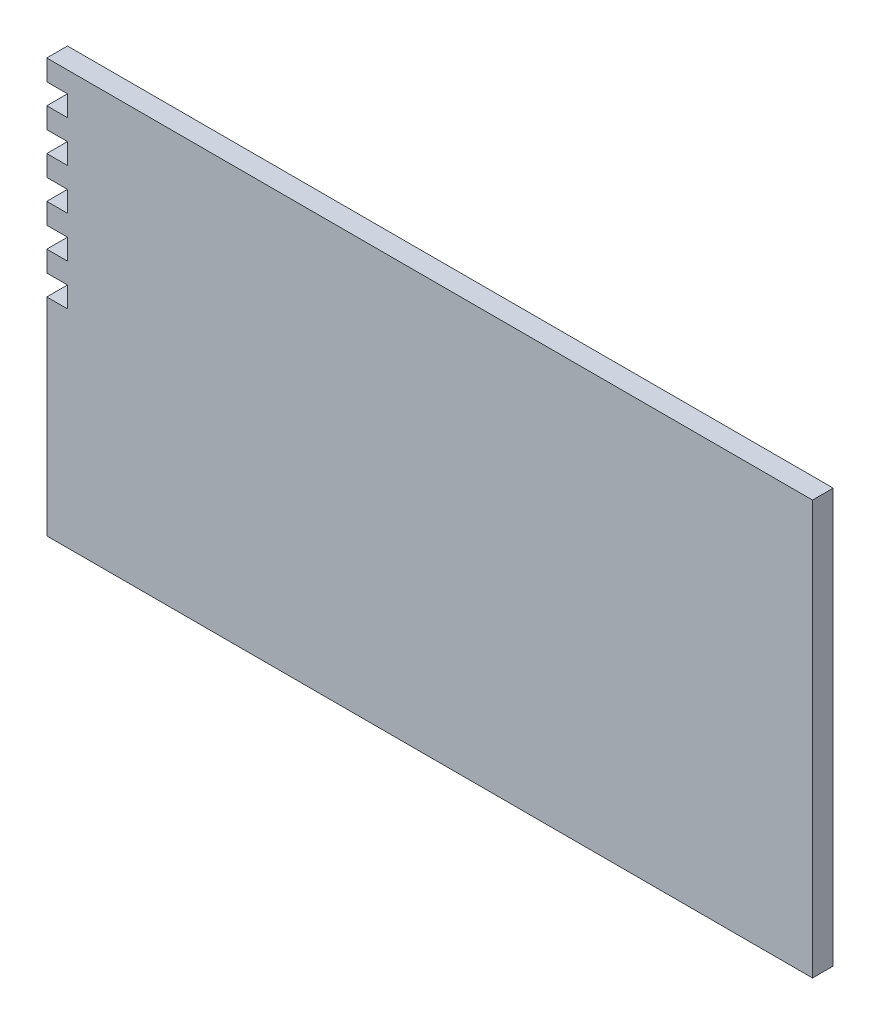
ISO-10303-21;
HEADER;
FILE_DESCRIPTION(('STEP AP214'),'2;1');
FILE_NAME('part.step','',(''),(''),'','','');
FILE_SCHEMA(('AUTOMOTIVE_DESIGN { 1 0 10303 214 1 1 1 1 }'));
ENDSEC;
DATA;
#1=APPLICATION_CONTEXT('core data for automotive mechanical design processes');
#2=APPLICATION_PROTOCOL_DEFINITION('international standard','automotive_design',2000,#1);
#3=PRODUCT_CONTEXT('',#1,'mechanical');
#4=PRODUCT('Part','Part','',(#3));
#5=PRODUCT_RELATED_PRODUCT_CATEGORY('part','',(#4));
#6=PRODUCT_DEFINITION_FORMATION('','',#4);
#7=PRODUCT_DEFINITION_CONTEXT('part definition',#1,'design');
#8=PRODUCT_DEFINITION('design','',#6,#7);
#9=PRODUCT_DEFINITION_SHAPE('','',#8);
#10=(LENGTH_UNIT() NAMED_UNIT(*) SI_UNIT(.MILLI.,.METRE.));
#11=(NAMED_UNIT(*) PLANE_ANGLE_UNIT() SI_UNIT($,.RADIAN.));
#12=(NAMED_UNIT(*) SI_UNIT($,.STERADIAN.) SOLID_ANGLE_UNIT());
#13=UNCERTAINTY_MEASURE_WITH_UNIT(LENGTH_MEASURE(1.E-05),#10,'distance_accuracy_value','');
#14=(GEOMETRIC_REPRESENTATION_CONTEXT(3) GLOBAL_UNCERTAINTY_ASSIGNED_CONTEXT((#13)) GLOBAL_UNIT_ASSIGNED_CONTEXT((#10,
#11,#12)) REPRESENTATION_CONTEXT('',''));
#15=CARTESIAN_POINT('',(0.,0.,0.));
#16=DIRECTION('',(0.,0.,1.));
#17=DIRECTION('',(1.,0.,0.));
#18=AXIS2_PLACEMENT_3D('',#15,#16,#17);
#19=CARTESIAN_POINT('',(-105.,-63.,6.));
#20=DIRECTION('',(1.,0.,0.));
#21=DIRECTION('',(0.,0.,-1.));
#22=AXIS2_PLACEMENT_3D('',#19,#20,#21);
#23=PLANE('',#22);
#24=DIRECTION('',(0.,-1.,0.));
#25=VECTOR('',#24,1.);
#26=CARTESIAN_POINT('',(-105.,-63.,0.));
#27=LINE('',#26,#25);
#28=CARTESIAN_POINT('',(-105.,21.,0.));
#29=VERTEX_POINT('',#28);
#30=CARTESIAN_POINT('',(-105.,15.,0.));
#31=VERTEX_POINT('',#30);
#32=EDGE_CURVE('E224',#29,#31,#27,.T.);
#33=ORIENTED_EDGE('',*,*,#32,.T.);
#34=DIRECTION('',(0.,0.,1.));
#35=VECTOR('',#34,1.);
#36=CARTESIAN_POINT('',(-105.,15.,0.));
#37=LINE('',#36,#35);
#38=CARTESIAN_POINT('',(-105.,15.,6.));
#39=VERTEX_POINT('',#38);
#40=EDGE_CURVE('E207',#31,#39,#37,.T.);
#41=ORIENTED_EDGE('',*,*,#40,.T.);
#42=DIRECTION('',(0.,-1.,0.));
#43=VECTOR('',#42,1.);
#44=CARTESIAN_POINT('',(-105.,-63.,6.));
#45=LINE('',#44,#43);
#46=CARTESIAN_POINT('',(-105.,21.,6.));
#47=VERTEX_POINT('',#46);
#48=EDGE_CURVE('E306',#47,#39,#45,.T.);
#49=ORIENTED_EDGE('',*,*,#48,.F.);
#50=DIRECTION('',(0.,0.,1.));
#51=VECTOR('',#50,1.);
#52=CARTESIAN_POINT('',(-105.,21.,0.));
#53=LINE('',#52,#51);
#54=EDGE_CURVE('E231',#29,#47,#53,.T.);
#55=ORIENTED_EDGE('',*,*,#54,.F.);
#56=EDGE_LOOP('',(#33,#41,#49,#55));
#57=FACE_BOUND('',#56,.T.);
#58=ADVANCED_FACE('F45',(#57),#23,.F.);
#59=CARTESIAN_POINT('',(-105.,33.,0.));
#60=VERTEX_POINT('',#59);
#61=CARTESIAN_POINT('',(-105.,27.,0.));
#62=VERTEX_POINT('',#61);
#63=EDGE_CURVE('E233',#60,#62,#27,.T.);
#64=ORIENTED_EDGE('',*,*,#63,.T.);
#65=DIRECTION('',(0.,0.,1.));
#66=VECTOR('',#65,1.);
#67=CARTESIAN_POINT('',(-105.,27.,0.));
#68=LINE('',#67,#66);
#69=CARTESIAN_POINT('',(-105.,27.,6.));
#70=VERTEX_POINT('',#69);
#71=EDGE_CURVE('E356',#62,#70,#68,.T.);
#72=ORIENTED_EDGE('',*,*,#71,.T.);
#73=CARTESIAN_POINT('',(-105.,33.,6.));
#74=VERTEX_POINT('',#73);
#75=EDGE_CURVE('E303',#74,#70,#45,.T.);
#76=ORIENTED_EDGE('',*,*,#75,.F.);
#77=DIRECTION('',(0.,0.,1.));
#78=VECTOR('',#77,1.);
#79=CARTESIAN_POINT('',(-105.,33.,0.));
#80=LINE('',#79,#78);
#81=EDGE_CURVE('E375',#60,#74,#80,.T.);
#82=ORIENTED_EDGE('',*,*,#81,.F.);
#83=EDGE_LOOP('',(#64,#72,#76,#82));
#84=FACE_BOUND('',#83,.T.);
#85=ADVANCED_FACE('F504',(#84),#23,.F.);
#86=CARTESIAN_POINT('',(-105.,45.,0.));
#87=VERTEX_POINT('',#86);
#88=CARTESIAN_POINT('',(-105.,39.,0.));
#89=VERTEX_POINT('',#88);
#90=EDGE_CURVE('E239',#87,#89,#27,.T.);
#91=ORIENTED_EDGE('',*,*,#90,.T.);
#92=DIRECTION('',(0.,0.,1.));
#93=VECTOR('',#92,1.);
#94=CARTESIAN_POINT('',(-105.,39.,0.));
#95=LINE('',#94,#93);
#96=CARTESIAN_POINT('',(-105.,39.,6.));
#97=VERTEX_POINT('',#96);
#98=EDGE_CURVE('E333',#89,#97,#95,.T.);
#99=ORIENTED_EDGE('',*,*,#98,.T.);
#100=CARTESIAN_POINT('',(-105.,45.,6.));
#101=VERTEX_POINT('',#100);
#102=EDGE_CURVE('E296',#101,#97,#45,.T.);
#103=ORIENTED_EDGE('',*,*,#102,.F.);
#104=DIRECTION('',(0.,0.,1.));
#105=VECTOR('',#104,1.);
#106=CARTESIAN_POINT('',(-105.,45.,0.));
#107=LINE('',#106,#105);
#108=EDGE_CURVE('E334',#87,#101,#107,.T.);
#109=ORIENTED_EDGE('',*,*,#108,.F.);
#110=EDGE_LOOP('',(#91,#99,#103,#109));
#111=FACE_BOUND('',#110,.T.);
#112=ADVANCED_FACE('F331',(#111),#23,.F.);
#113=CARTESIAN_POINT('',(-105.,57.,0.));
#114=VERTEX_POINT('',#113);
#115=CARTESIAN_POINT('',(-105.,51.,0.));
#116=VERTEX_POINT('',#115);
#117=EDGE_CURVE('E241',#114,#116,#27,.T.);
#118=ORIENTED_EDGE('',*,*,#117,.T.);
#119=DIRECTION('',(0.,0.,1.));
#120=VECTOR('',#119,1.);
#121=CARTESIAN_POINT('',(-105.,51.,0.));
#122=LINE('',#121,#120);
#123=CARTESIAN_POINT('',(-105.,51.,6.));
#124=VERTEX_POINT('',#123);
#125=EDGE_CURVE('E291',#116,#124,#122,.T.);
#126=ORIENTED_EDGE('',*,*,#125,.T.);
#127=CARTESIAN_POINT('',(-105.,57.,6.));
#128=VERTEX_POINT('',#127);
#129=EDGE_CURVE('E290',#128,#124,#45,.T.);
#130=ORIENTED_EDGE('',*,*,#129,.F.);
#131=DIRECTION('',(0.,0.,-1.));
#132=VECTOR('',#131,1.);
#133=CARTESIAN_POINT('',(-105.,57.,6.));
#134=LINE('',#133,#132);
#135=EDGE_CURVE('E258',#128,#114,#134,.T.);
#136=ORIENTED_EDGE('',*,*,#135,.T.);
#137=EDGE_LOOP('',(#118,#126,#130,#136));
#138=FACE_BOUND('',#137,.T.);
#139=ADVANCED_FACE('F287',(#138),#23,.F.);
#140=CARTESIAN_POINT('',(-105.,8.99999999999999,6.));
#141=VERTEX_POINT('',#140);
#142=CARTESIAN_POINT('',(-105.,2.99999999999999,6.));
#143=VERTEX_POINT('',#142);
#144=EDGE_CURVE('E298',#141,#143,#45,.T.);
#145=ORIENTED_EDGE('',*,*,#144,.F.);
#146=DIRECTION('',(0.,0.,1.));
#147=VECTOR('',#146,1.);
#148=CARTESIAN_POINT('',(-105.,8.99999999999999,0.));
#149=LINE('',#148,#147);
#150=CARTESIAN_POINT('',(-105.,8.99999999999999,0.));
#151=VERTEX_POINT('',#150);
#152=EDGE_CURVE('E218',#151,#141,#149,.T.);
#153=ORIENTED_EDGE('',*,*,#152,.F.);
#154=CARTESIAN_POINT('',(-105.,2.99999999999999,0.));
#155=VERTEX_POINT('',#154);
#156=EDGE_CURVE('E234',#151,#155,#27,.T.);
#157=ORIENTED_EDGE('',*,*,#156,.T.);
#158=DIRECTION('',(0.,0.,1.));
#159=VECTOR('',#158,1.);
#160=CARTESIAN_POINT('',(-105.,2.99999999999999,0.));
#161=LINE('',#160,#159);
#162=EDGE_CURVE('E420',#155,#143,#161,.T.);
#163=ORIENTED_EDGE('',*,*,#162,.T.);
#164=EDGE_LOOP('',(#145,#153,#157,#163));
#165=FACE_BOUND('',#164,.T.);
#166=ADVANCED_FACE('F439',(#165),#23,.F.);
#167=CARTESIAN_POINT('',(-105.,-3.00000000000001,6.));
#168=VERTEX_POINT('',#167);
#169=CARTESIAN_POINT('',(-105.,-63.,6.));
#170=VERTEX_POINT('',#169);
#171=EDGE_CURVE('E257',#168,#170,#45,.T.);
#172=ORIENTED_EDGE('',*,*,#171,.F.);
#173=DIRECTION('',(0.,0.,1.));
#174=VECTOR('',#173,1.);
#175=CARTESIAN_POINT('',(-105.,-3.00000000000001,0.));
#176=LINE('',#175,#174);
#177=CARTESIAN_POINT('',(-105.,-3.00000000000001,0.));
#178=VERTEX_POINT('',#177);
#179=EDGE_CURVE('E318',#178,#168,#176,.T.);
#180=ORIENTED_EDGE('',*,*,#179,.F.);
#181=CARTESIAN_POINT('',(-105.,-63.,0.));
#182=VERTEX_POINT('',#181);
#183=EDGE_CURVE('E240',#178,#182,#27,.T.);
#184=ORIENTED_EDGE('',*,*,#183,.T.);
#185=DIRECTION('',(0.,0.,-1.));
#186=VECTOR('',#185,1.);
#187=CARTESIAN_POINT('',(-105.,-63.,6.));
#188=LINE('',#187,#186);
#189=EDGE_CURVE('E11',#170,#182,#188,.T.);
#190=ORIENTED_EDGE('',*,*,#189,.F.);
#191=EDGE_LOOP('',(#172,#180,#184,#190));
#192=FACE_BOUND('',#191,.T.);
#193=ADVANCED_FACE('F47',(#192),#23,.F.);
#194=CARTESIAN_POINT('',(117.,-63.,6.));
#195=DIRECTION('',(0.,1.,0.));
#196=DIRECTION('',(-1.,0.,0.));
#197=AXIS2_PLACEMENT_3D('',#194,#195,#196);
#198=PLANE('',#197);
#199=DIRECTION('',(1.,0.,0.));
#200=VECTOR('',#199,1.);
#201=CARTESIAN_POINT('',(117.,-63.,0.));
#202=LINE('',#201,#200);
#203=CARTESIAN_POINT('',(117.,-63.,0.));
#204=VERTEX_POINT('',#203);
#205=EDGE_CURVE('E246',#182,#204,#202,.T.);
#206=ORIENTED_EDGE('',*,*,#205,.T.);
#207=DIRECTION('',(0.,0.,-1.));
#208=VECTOR('',#207,1.);
#209=CARTESIAN_POINT('',(117.,-63.,6.));
#210=LINE('',#209,#208);
#211=CARTESIAN_POINT('',(117.,-63.,6.));
#212=VERTEX_POINT('',#211);
#213=EDGE_CURVE('E54',#212,#204,#210,.T.);
#214=ORIENTED_EDGE('',*,*,#213,.F.);
#215=DIRECTION('',(1.,0.,0.));
#216=VECTOR('',#215,1.);
#217=CARTESIAN_POINT('',(117.,-63.,6.));
#218=LINE('',#217,#216);
#219=EDGE_CURVE('E295',#170,#212,#218,.T.);
#220=ORIENTED_EDGE('',*,*,#219,.F.);
#221=ORIENTED_EDGE('',*,*,#189,.T.);
#222=EDGE_LOOP('',(#206,#214,#220,#221));
#223=FACE_BOUND('',#222,.T.);
#224=ADVANCED_FACE('F317',(#223),#198,.F.);
#225=CARTESIAN_POINT('',(117.,-63.,6.));
#226=DIRECTION('',(-1.,0.,0.));
#227=DIRECTION('',(0.,0.,1.));
#228=AXIS2_PLACEMENT_3D('',#225,#226,#227);
#229=PLANE('',#228);
#230=DIRECTION('',(0.,1.,0.));
#231=VECTOR('',#230,1.);
#232=CARTESIAN_POINT('',(117.,-63.,0.));
#233=LINE('',#232,#231);
#234=CARTESIAN_POINT('',(117.,57.,0.));
#235=VERTEX_POINT('',#234);
#236=EDGE_CURVE('E251',#204,#235,#233,.T.);
#237=ORIENTED_EDGE('',*,*,#236,.T.);
#238=DIRECTION('',(0.,0.,-1.));
#239=VECTOR('',#238,1.);
#240=CARTESIAN_POINT('',(117.,57.,6.));
#241=LINE('',#240,#239);
#242=CARTESIAN_POINT('',(117.,57.,6.));
#243=VERTEX_POINT('',#242);
#244=EDGE_CURVE('E262',#243,#235,#241,.T.);
#245=ORIENTED_EDGE('',*,*,#244,.F.);
#246=DIRECTION('',(0.,1.,0.));
#247=VECTOR('',#246,1.);
#248=CARTESIAN_POINT('',(117.,-63.,6.));
#249=LINE('',#248,#247);
#250=EDGE_CURVE('E273',#212,#243,#249,.T.);
#251=ORIENTED_EDGE('',*,*,#250,.F.);
#252=ORIENTED_EDGE('',*,*,#213,.T.);
#253=EDGE_LOOP('',(#237,#245,#251,#252));
#254=FACE_BOUND('',#253,.T.);
#255=ADVANCED_FACE('F271',(#254),#229,.F.);
#256=CARTESIAN_POINT('',(117.,57.,6.));
#257=DIRECTION('',(0.,-1.,0.));
#258=DIRECTION('',(1.,0.,0.));
#259=AXIS2_PLACEMENT_3D('',#256,#257,#258);
#260=PLANE('',#259);
#261=DIRECTION('',(-1.,0.,0.));
#262=VECTOR('',#261,1.);
#263=CARTESIAN_POINT('',(117.,57.,0.));
#264=LINE('',#263,#262);
#265=EDGE_CURVE('E254',#235,#114,#264,.T.);
#266=ORIENTED_EDGE('',*,*,#265,.T.);
#267=ORIENTED_EDGE('',*,*,#135,.F.);
#268=DIRECTION('',(-1.,0.,0.));
#269=VECTOR('',#268,1.);
#270=CARTESIAN_POINT('',(117.,57.,6.));
#271=LINE('',#270,#269);
#272=EDGE_CURVE('E247',#243,#128,#271,.T.);
#273=ORIENTED_EDGE('',*,*,#272,.F.);
#274=ORIENTED_EDGE('',*,*,#244,.T.);
#275=EDGE_LOOP('',(#266,#267,#273,#274));
#276=FACE_BOUND('',#275,.T.);
#277=ADVANCED_FACE('F283',(#276),#260,.F.);
#278=CARTESIAN_POINT('',(0.,0.,6.));
#279=DIRECTION('',(0.,0.,1.));
#280=DIRECTION('',(1.,0.,0.));
#281=AXIS2_PLACEMENT_3D('',#278,#279,#280);
#282=PLANE('',#281);
#283=DIRECTION('',(-1.,0.,0.));
#284=VECTOR('',#283,1.);
#285=CARTESIAN_POINT('',(-105.,15.,6.));
#286=LINE('',#285,#284);
#287=CARTESIAN_POINT('',(-99.,15.,6.));
#288=VERTEX_POINT('',#287);
#289=EDGE_CURVE('E212',#288,#39,#286,.T.);
#290=ORIENTED_EDGE('',*,*,#289,.F.);
#291=DIRECTION('',(0.,1.,0.));
#292=VECTOR('',#291,1.);
#293=CARTESIAN_POINT('',(-99.,15.,6.));
#294=LINE('',#293,#292);
#295=CARTESIAN_POINT('',(-99.,8.99999999999999,6.));
#296=VERTEX_POINT('',#295);
#297=EDGE_CURVE('E228',#296,#288,#294,.T.);
#298=ORIENTED_EDGE('',*,*,#297,.F.);
#299=DIRECTION('',(1.,0.,0.));
#300=VECTOR('',#299,1.);
#301=CARTESIAN_POINT('',(-99.,8.99999999999999,6.));
#302=LINE('',#301,#300);
#303=EDGE_CURVE('E454',#141,#296,#302,.T.);
#304=ORIENTED_EDGE('',*,*,#303,.F.);
#305=ORIENTED_EDGE('',*,*,#144,.T.);
#306=DIRECTION('',(-1.,0.,0.));
#307=VECTOR('',#306,1.);
#308=CARTESIAN_POINT('',(-105.,2.99999999999999,6.));
#309=LINE('',#308,#307);
#310=CARTESIAN_POINT('',(-99.,2.99999999999999,6.));
#311=VERTEX_POINT('',#310);
#312=EDGE_CURVE('E421',#311,#143,#309,.T.);
#313=ORIENTED_EDGE('',*,*,#312,.F.);
#314=DIRECTION('',(0.,1.,0.));
#315=VECTOR('',#314,1.);
#316=CARTESIAN_POINT('',(-99.,2.99999999999999,6.));
#317=LINE('',#316,#315);
#318=CARTESIAN_POINT('',(-99.,-3.00000000000001,6.));
#319=VERTEX_POINT('',#318);
#320=EDGE_CURVE('E413',#319,#311,#317,.T.);
#321=ORIENTED_EDGE('',*,*,#320,.F.);
#322=DIRECTION('',(1.,0.,0.));
#323=VECTOR('',#322,1.);
#324=CARTESIAN_POINT('',(-99.,-3.00000000000001,6.));
#325=LINE('',#324,#323);
#326=EDGE_CURVE('E313',#168,#319,#325,.T.);
#327=ORIENTED_EDGE('',*,*,#326,.F.);
#328=ORIENTED_EDGE('',*,*,#171,.T.);
#329=ORIENTED_EDGE('',*,*,#219,.T.);
#330=ORIENTED_EDGE('',*,*,#250,.T.);
#331=ORIENTED_EDGE('',*,*,#272,.T.);
#332=ORIENTED_EDGE('',*,*,#129,.T.);
#333=DIRECTION('',(-1.,0.,0.));
#334=VECTOR('',#333,1.);
#335=CARTESIAN_POINT('',(-105.,51.,6.));
#336=LINE('',#335,#334);
#337=CARTESIAN_POINT('',(-99.,51.,6.));
#338=VERTEX_POINT('',#337);
#339=EDGE_CURVE('E389',#338,#124,#336,.T.);
#340=ORIENTED_EDGE('',*,*,#339,.F.);
#341=DIRECTION('',(0.,1.,0.));
#342=VECTOR('',#341,1.);
#343=CARTESIAN_POINT('',(-99.,51.,6.));
#344=LINE('',#343,#342);
#345=CARTESIAN_POINT('',(-99.,45.,6.));
#346=VERTEX_POINT('',#345);
#347=EDGE_CURVE('E383',#346,#338,#344,.T.);
#348=ORIENTED_EDGE('',*,*,#347,.F.);
#349=DIRECTION('',(1.,0.,0.));
#350=VECTOR('',#349,1.);
#351=CARTESIAN_POINT('',(-99.,45.,6.));
#352=LINE('',#351,#350);
#353=EDGE_CURVE('E392',#101,#346,#352,.T.);
#354=ORIENTED_EDGE('',*,*,#353,.F.);
#355=ORIENTED_EDGE('',*,*,#102,.T.);
#356=DIRECTION('',(-1.,0.,0.));
#357=VECTOR('',#356,1.);
#358=CARTESIAN_POINT('',(-105.,39.,6.));
#359=LINE('',#358,#357);
#360=CARTESIAN_POINT('',(-99.,39.,6.));
#361=VERTEX_POINT('',#360);
#362=EDGE_CURVE('E361',#361,#97,#359,.T.);
#363=ORIENTED_EDGE('',*,*,#362,.F.);
#364=DIRECTION('',(0.,1.,0.));
#365=VECTOR('',#364,1.);
#366=CARTESIAN_POINT('',(-99.,39.,6.));
#367=LINE('',#366,#365);
#368=CARTESIAN_POINT('',(-99.,33.,6.));
#369=VERTEX_POINT('',#368);
#370=EDGE_CURVE('E347',#369,#361,#367,.T.);
#371=ORIENTED_EDGE('',*,*,#370,.F.);
#372=DIRECTION('',(1.,0.,0.));
#373=VECTOR('',#372,1.);
#374=CARTESIAN_POINT('',(-99.,33.,6.));
#375=LINE('',#374,#373);
#376=EDGE_CURVE('E353',#74,#369,#375,.T.);
#377=ORIENTED_EDGE('',*,*,#376,.F.);
#378=ORIENTED_EDGE('',*,*,#75,.T.);
#379=DIRECTION('',(-1.,0.,0.));
#380=VECTOR('',#379,1.);
#381=CARTESIAN_POINT('',(-105.,27.,6.));
#382=LINE('',#381,#380);
#383=CARTESIAN_POINT('',(-99.,27.,6.));
#384=VERTEX_POINT('',#383);
#385=EDGE_CURVE('E371',#384,#70,#382,.T.);
#386=ORIENTED_EDGE('',*,*,#385,.F.);
#387=DIRECTION('',(0.,1.,0.));
#388=VECTOR('',#387,1.);
#389=CARTESIAN_POINT('',(-99.,27.,6.));
#390=LINE('',#389,#388);
#391=CARTESIAN_POINT('',(-99.,21.,6.));
#392=VERTEX_POINT('',#391);
#393=EDGE_CURVE('E478',#392,#384,#390,.T.);
#394=ORIENTED_EDGE('',*,*,#393,.F.);
#395=DIRECTION('',(1.,0.,0.));
#396=VECTOR('',#395,1.);
#397=CARTESIAN_POINT('',(-99.,21.,6.));
#398=LINE('',#397,#396);
#399=EDGE_CURVE('E485',#47,#392,#398,.T.);
#400=ORIENTED_EDGE('',*,*,#399,.F.);
#401=ORIENTED_EDGE('',*,*,#48,.T.);
#402=EDGE_LOOP('',(#290,#298,#304,#305,#313,#321,#327,#328,#329,#330,#331,#332,#340,#348,#354,
#355,#363,#371,#377,#378,#386,#394,#400,#401));
#403=FACE_BOUND('',#402,.T.);
#404=ADVANCED_FACE('F310',(#403),#282,.T.);
#405=CARTESIAN_POINT('',(0.,0.,0.));
#406=DIRECTION('',(0.,0.,1.));
#407=DIRECTION('',(1.,0.,0.));
#408=AXIS2_PLACEMENT_3D('',#405,#406,#407);
#409=PLANE('',#408);
#410=DIRECTION('',(0.,1.,0.));
#411=VECTOR('',#410,1.);
#412=CARTESIAN_POINT('',(-99.,15.,0.));
#413=LINE('',#412,#411);
#414=CARTESIAN_POINT('',(-99.,8.99999999999999,0.));
#415=VERTEX_POINT('',#414);
#416=CARTESIAN_POINT('',(-99.,15.,0.));
#417=VERTEX_POINT('',#416);
#418=EDGE_CURVE('E61',#415,#417,#413,.T.);
#419=ORIENTED_EDGE('',*,*,#418,.T.);
#420=DIRECTION('',(-1.,0.,0.));
#421=VECTOR('',#420,1.);
#422=CARTESIAN_POINT('',(-105.,15.,0.));
#423=LINE('',#422,#421);
#424=EDGE_CURVE('E210',#417,#31,#423,.T.);
#425=ORIENTED_EDGE('',*,*,#424,.T.);
#426=ORIENTED_EDGE('',*,*,#32,.F.);
#427=DIRECTION('',(1.,0.,0.));
#428=VECTOR('',#427,1.);
#429=CARTESIAN_POINT('',(-99.,21.,0.));
#430=LINE('',#429,#428);
#431=CARTESIAN_POINT('',(-99.,21.,0.));
#432=VERTEX_POINT('',#431);
#433=EDGE_CURVE('E477',#29,#432,#430,.T.);
#434=ORIENTED_EDGE('',*,*,#433,.T.);
#435=DIRECTION('',(0.,1.,0.));
#436=VECTOR('',#435,1.);
#437=CARTESIAN_POINT('',(-99.,27.,0.));
#438=LINE('',#437,#436);
#439=CARTESIAN_POINT('',(-99.,27.,0.));
#440=VERTEX_POINT('',#439);
#441=EDGE_CURVE('E69',#432,#440,#438,.T.);
#442=ORIENTED_EDGE('',*,*,#441,.T.);
#443=DIRECTION('',(-1.,0.,0.));
#444=VECTOR('',#443,1.);
#445=CARTESIAN_POINT('',(-105.,27.,0.));
#446=LINE('',#445,#444);
#447=EDGE_CURVE('E473',#440,#62,#446,.T.);
#448=ORIENTED_EDGE('',*,*,#447,.T.);
#449=ORIENTED_EDGE('',*,*,#63,.F.);
#450=DIRECTION('',(1.,0.,0.));
#451=VECTOR('',#450,1.);
#452=CARTESIAN_POINT('',(-99.,33.,0.));
#453=LINE('',#452,#451);
#454=CARTESIAN_POINT('',(-99.,33.,0.));
#455=VERTEX_POINT('',#454);
#456=EDGE_CURVE('E346',#60,#455,#453,.T.);
#457=ORIENTED_EDGE('',*,*,#456,.T.);
#458=DIRECTION('',(0.,1.,0.));
#459=VECTOR('',#458,1.);
#460=CARTESIAN_POINT('',(-99.,39.,0.));
#461=LINE('',#460,#459);
#462=CARTESIAN_POINT('',(-99.,39.,0.));
#463=VERTEX_POINT('',#462);
#464=EDGE_CURVE('E343',#455,#463,#461,.T.);
#465=ORIENTED_EDGE('',*,*,#464,.T.);
#466=DIRECTION('',(-1.,0.,0.));
#467=VECTOR('',#466,1.);
#468=CARTESIAN_POINT('',(-105.,39.,0.));
#469=LINE('',#468,#467);
#470=EDGE_CURVE('E341',#463,#89,#469,.T.);
#471=ORIENTED_EDGE('',*,*,#470,.T.);
#472=ORIENTED_EDGE('',*,*,#90,.F.);
#473=DIRECTION('',(1.,0.,0.));
#474=VECTOR('',#473,1.);
#475=CARTESIAN_POINT('',(-99.,45.,0.));
#476=LINE('',#475,#474);
#477=CARTESIAN_POINT('',(-99.,45.,0.));
#478=VERTEX_POINT('',#477);
#479=EDGE_CURVE('E338',#87,#478,#476,.T.);
#480=ORIENTED_EDGE('',*,*,#479,.T.);
#481=DIRECTION('',(0.,1.,0.));
#482=VECTOR('',#481,1.);
#483=CARTESIAN_POINT('',(-99.,51.,0.));
#484=LINE('',#483,#482);
#485=CARTESIAN_POINT('',(-99.,51.,0.));
#486=VERTEX_POINT('',#485);
#487=EDGE_CURVE('E386',#478,#486,#484,.T.);
#488=ORIENTED_EDGE('',*,*,#487,.T.);
#489=DIRECTION('',(-1.,0.,0.));
#490=VECTOR('',#489,1.);
#491=CARTESIAN_POINT('',(-105.,51.,0.));
#492=LINE('',#491,#490);
#493=EDGE_CURVE('E380',#486,#116,#492,.T.);
#494=ORIENTED_EDGE('',*,*,#493,.T.);
#495=ORIENTED_EDGE('',*,*,#117,.F.);
#496=ORIENTED_EDGE('',*,*,#265,.F.);
#497=ORIENTED_EDGE('',*,*,#236,.F.);
#498=ORIENTED_EDGE('',*,*,#205,.F.);
#499=ORIENTED_EDGE('',*,*,#183,.F.);
#500=DIRECTION('',(1.,0.,0.));
#501=VECTOR('',#500,1.);
#502=CARTESIAN_POINT('',(-99.,-3.00000000000001,0.));
#503=LINE('',#502,#501);
#504=CARTESIAN_POINT('',(-99.,-3.00000000000001,0.));
#505=VERTEX_POINT('',#504);
#506=EDGE_CURVE('E412',#178,#505,#503,.T.);
#507=ORIENTED_EDGE('',*,*,#506,.T.);
#508=DIRECTION('',(0.,1.,0.));
#509=VECTOR('',#508,1.);
#510=CARTESIAN_POINT('',(-99.,2.99999999999999,0.));
#511=LINE('',#510,#509);
#512=CARTESIAN_POINT('',(-99.,2.99999999999999,0.));
#513=VERTEX_POINT('',#512);
#514=EDGE_CURVE('E416',#505,#513,#511,.T.);
#515=ORIENTED_EDGE('',*,*,#514,.T.);
#516=DIRECTION('',(-1.,0.,0.));
#517=VECTOR('',#516,1.);
#518=CARTESIAN_POINT('',(-105.,2.99999999999999,0.));
#519=LINE('',#518,#517);
#520=EDGE_CURVE('E408',#513,#155,#519,.T.);
#521=ORIENTED_EDGE('',*,*,#520,.T.);
#522=ORIENTED_EDGE('',*,*,#156,.F.);
#523=DIRECTION('',(1.,0.,0.));
#524=VECTOR('',#523,1.);
#525=CARTESIAN_POINT('',(-99.,8.99999999999999,0.));
#526=LINE('',#525,#524);
#527=EDGE_CURVE('E227',#151,#415,#526,.T.);
#528=ORIENTED_EDGE('',*,*,#527,.T.);
#529=EDGE_LOOP('',(#419,#425,#426,#434,#442,#448,#449,#457,#465,#471,#472,#480,#488,#494,#495,
#496,#497,#498,#499,#507,#515,#521,#522,#528));
#530=FACE_BOUND('',#529,.T.);
#531=ADVANCED_FACE('F222',(#530),#409,.F.);
#532=CARTESIAN_POINT('',(-105.,2.99999999999999,0.));
#533=DIRECTION('',(0.,1.,0.));
#534=DIRECTION('',(0.,0.,1.));
#535=AXIS2_PLACEMENT_3D('',#532,#533,#534);
#536=PLANE('',#535);
#537=ORIENTED_EDGE('',*,*,#312,.T.);
#538=ORIENTED_EDGE('',*,*,#162,.F.);
#539=ORIENTED_EDGE('',*,*,#520,.F.);
#540=DIRECTION('',(0.,0.,1.));
#541=VECTOR('',#540,1.);
#542=CARTESIAN_POINT('',(-99.,2.99999999999999,0.));
#543=LINE('',#542,#541);
#544=EDGE_CURVE('E321',#513,#311,#543,.T.);
#545=ORIENTED_EDGE('',*,*,#544,.T.);
#546=EDGE_LOOP('',(#537,#538,#539,#545));
#547=FACE_BOUND('',#546,.T.);
#548=ADVANCED_FACE('F444',(#547),#536,.F.);
#549=CARTESIAN_POINT('',(-99.,2.99999999999999,0.));
#550=DIRECTION('',(1.,0.,0.));
#551=DIRECTION('',(0.,0.,-1.));
#552=AXIS2_PLACEMENT_3D('',#549,#550,#551);
#553=PLANE('',#552);
#554=ORIENTED_EDGE('',*,*,#320,.T.);
#555=ORIENTED_EDGE('',*,*,#544,.F.);
#556=ORIENTED_EDGE('',*,*,#514,.F.);
#557=DIRECTION('',(0.,0.,1.));
#558=VECTOR('',#557,1.);
#559=CARTESIAN_POINT('',(-99.,-3.00000000000001,0.));
#560=LINE('',#559,#558);
#561=EDGE_CURVE('E323',#505,#319,#560,.T.);
#562=ORIENTED_EDGE('',*,*,#561,.T.);
#563=EDGE_LOOP('',(#554,#555,#556,#562));
#564=FACE_BOUND('',#563,.T.);
#565=ADVANCED_FACE('F448',(#564),#553,.F.);
#566=CARTESIAN_POINT('',(-99.,-3.00000000000001,0.));
#567=DIRECTION('',(0.,-1.,0.));
#568=DIRECTION('',(1.,0.,0.));
#569=AXIS2_PLACEMENT_3D('',#566,#567,#568);
#570=PLANE('',#569);
#571=ORIENTED_EDGE('',*,*,#326,.T.);
#572=ORIENTED_EDGE('',*,*,#561,.F.);
#573=ORIENTED_EDGE('',*,*,#506,.F.);
#574=ORIENTED_EDGE('',*,*,#179,.T.);
#575=EDGE_LOOP('',(#571,#572,#573,#574));
#576=FACE_BOUND('',#575,.T.);
#577=ADVANCED_FACE('F450',(#576),#570,.F.);
#578=CARTESIAN_POINT('',(-105.,51.,0.));
#579=DIRECTION('',(0.,1.,0.));
#580=DIRECTION('',(0.,0.,1.));
#581=AXIS2_PLACEMENT_3D('',#578,#579,#580);
#582=PLANE('',#581);
#583=ORIENTED_EDGE('',*,*,#339,.T.);
#584=ORIENTED_EDGE('',*,*,#125,.F.);
#585=ORIENTED_EDGE('',*,*,#493,.F.);
#586=DIRECTION('',(0.,0.,1.));
#587=VECTOR('',#586,1.);
#588=CARTESIAN_POINT('',(-99.,51.,0.));
#589=LINE('',#588,#587);
#590=EDGE_CURVE('E364',#486,#338,#589,.T.);
#591=ORIENTED_EDGE('',*,*,#590,.T.);
#592=EDGE_LOOP('',(#583,#584,#585,#591));
#593=FACE_BOUND('',#592,.T.);
#594=ADVANCED_FACE('F564',(#593),#582,.F.);
#595=CARTESIAN_POINT('',(-99.,51.,0.));
#596=DIRECTION('',(1.,0.,0.));
#597=DIRECTION('',(0.,0.,-1.));
#598=AXIS2_PLACEMENT_3D('',#595,#596,#597);
#599=PLANE('',#598);
#600=ORIENTED_EDGE('',*,*,#347,.T.);
#601=ORIENTED_EDGE('',*,*,#590,.F.);
#602=ORIENTED_EDGE('',*,*,#487,.F.);
#603=DIRECTION('',(0.,0.,1.));
#604=VECTOR('',#603,1.);
#605=CARTESIAN_POINT('',(-99.,45.,0.));
#606=LINE('',#605,#604);
#607=EDGE_CURVE('E401',#478,#346,#606,.T.);
#608=ORIENTED_EDGE('',*,*,#607,.T.);
#609=EDGE_LOOP('',(#600,#601,#602,#608));
#610=FACE_BOUND('',#609,.T.);
#611=ADVANCED_FACE('F569',(#610),#599,.F.);
#612=CARTESIAN_POINT('',(-99.,45.,0.));
#613=DIRECTION('',(0.,-1.,0.));
#614=DIRECTION('',(1.,0.,0.));
#615=AXIS2_PLACEMENT_3D('',#612,#613,#614);
#616=PLANE('',#615);
#617=ORIENTED_EDGE('',*,*,#353,.T.);
#618=ORIENTED_EDGE('',*,*,#607,.F.);
#619=ORIENTED_EDGE('',*,*,#479,.F.);
#620=ORIENTED_EDGE('',*,*,#108,.T.);
#621=EDGE_LOOP('',(#617,#618,#619,#620));
#622=FACE_BOUND('',#621,.T.);
#623=ADVANCED_FACE('F580',(#622),#616,.F.);
#624=CARTESIAN_POINT('',(-105.,39.,0.));
#625=DIRECTION('',(0.,1.,0.));
#626=DIRECTION('',(0.,0.,1.));
#627=AXIS2_PLACEMENT_3D('',#624,#625,#626);
#628=PLANE('',#627);
#629=ORIENTED_EDGE('',*,*,#362,.T.);
#630=ORIENTED_EDGE('',*,*,#98,.F.);
#631=ORIENTED_EDGE('',*,*,#470,.F.);
#632=DIRECTION('',(0.,0.,1.));
#633=VECTOR('',#632,1.);
#634=CARTESIAN_POINT('',(-99.,39.,0.));
#635=LINE('',#634,#633);
#636=EDGE_CURVE('E368',#463,#361,#635,.T.);
#637=ORIENTED_EDGE('',*,*,#636,.T.);
#638=EDGE_LOOP('',(#629,#630,#631,#637));
#639=FACE_BOUND('',#638,.T.);
#640=ADVANCED_FACE('F590',(#639),#628,.F.);
#641=CARTESIAN_POINT('',(-99.,39.,0.));
#642=DIRECTION('',(1.,0.,0.));
#643=DIRECTION('',(0.,0.,-1.));
#644=AXIS2_PLACEMENT_3D('',#641,#642,#643);
#645=PLANE('',#644);
#646=ORIENTED_EDGE('',*,*,#370,.T.);
#647=ORIENTED_EDGE('',*,*,#636,.F.);
#648=ORIENTED_EDGE('',*,*,#464,.F.);
#649=DIRECTION('',(0.,0.,1.));
#650=VECTOR('',#649,1.);
#651=CARTESIAN_POINT('',(-99.,33.,0.));
#652=LINE('',#651,#650);
#653=EDGE_CURVE('E372',#455,#369,#652,.T.);
#654=ORIENTED_EDGE('',*,*,#653,.T.);
#655=EDGE_LOOP('',(#646,#647,#648,#654));
#656=FACE_BOUND('',#655,.T.);
#657=ADVANCED_FACE('F600',(#656),#645,.F.);
#658=CARTESIAN_POINT('',(-99.,33.,0.));
#659=DIRECTION('',(0.,-1.,0.));
#660=DIRECTION('',(1.,0.,0.));
#661=AXIS2_PLACEMENT_3D('',#658,#659,#660);
#662=PLANE('',#661);
#663=ORIENTED_EDGE('',*,*,#376,.T.);
#664=ORIENTED_EDGE('',*,*,#653,.F.);
#665=ORIENTED_EDGE('',*,*,#456,.F.);
#666=ORIENTED_EDGE('',*,*,#81,.T.);
#667=EDGE_LOOP('',(#663,#664,#665,#666));
#668=FACE_BOUND('',#667,.T.);
#669=ADVANCED_FACE('F525',(#668),#662,.F.);
#670=CARTESIAN_POINT('',(-105.,27.,0.));
#671=DIRECTION('',(0.,1.,0.));
#672=DIRECTION('',(0.,0.,1.));
#673=AXIS2_PLACEMENT_3D('',#670,#671,#672);
#674=PLANE('',#673);
#675=ORIENTED_EDGE('',*,*,#385,.T.);
#676=ORIENTED_EDGE('',*,*,#71,.F.);
#677=ORIENTED_EDGE('',*,*,#447,.F.);
#678=DIRECTION('',(0.,0.,1.));
#679=VECTOR('',#678,1.);
#680=CARTESIAN_POINT('',(-99.,27.,0.));
#681=LINE('',#680,#679);
#682=EDGE_CURVE('E462',#440,#384,#681,.T.);
#683=ORIENTED_EDGE('',*,*,#682,.T.);
#684=EDGE_LOOP('',(#675,#676,#677,#683));
#685=FACE_BOUND('',#684,.T.);
#686=ADVANCED_FACE('F516',(#685),#674,.F.);
#687=CARTESIAN_POINT('',(-99.,27.,0.));
#688=DIRECTION('',(1.,0.,0.));
#689=DIRECTION('',(0.,0.,-1.));
#690=AXIS2_PLACEMENT_3D('',#687,#688,#689);
#691=PLANE('',#690);
#692=ORIENTED_EDGE('',*,*,#393,.T.);
#693=ORIENTED_EDGE('',*,*,#682,.F.);
#694=ORIENTED_EDGE('',*,*,#441,.F.);
#695=DIRECTION('',(0.,0.,1.));
#696=VECTOR('',#695,1.);
#697=CARTESIAN_POINT('',(-99.,21.,0.));
#698=LINE('',#697,#696);
#699=EDGE_CURVE('E494',#432,#392,#698,.T.);
#700=ORIENTED_EDGE('',*,*,#699,.T.);
#701=EDGE_LOOP('',(#692,#693,#694,#700));
#702=FACE_BOUND('',#701,.T.);
#703=ADVANCED_FACE('F517',(#702),#691,.F.);
#704=CARTESIAN_POINT('',(-99.,21.,0.));
#705=DIRECTION('',(0.,-1.,0.));
#706=DIRECTION('',(1.,0.,0.));
#707=AXIS2_PLACEMENT_3D('',#704,#705,#706);
#708=PLANE('',#707);
#709=ORIENTED_EDGE('',*,*,#399,.T.);
#710=ORIENTED_EDGE('',*,*,#699,.F.);
#711=ORIENTED_EDGE('',*,*,#433,.F.);
#712=ORIENTED_EDGE('',*,*,#54,.T.);
#713=EDGE_LOOP('',(#709,#710,#711,#712));
#714=FACE_BOUND('',#713,.T.);
#715=ADVANCED_FACE('F515',(#714),#708,.F.);
#716=CARTESIAN_POINT('',(-105.,15.,0.));
#717=DIRECTION('',(0.,1.,0.));
#718=DIRECTION('',(0.,0.,1.));
#719=AXIS2_PLACEMENT_3D('',#716,#717,#718);
#720=PLANE('',#719);
#721=ORIENTED_EDGE('',*,*,#289,.T.);
#722=ORIENTED_EDGE('',*,*,#40,.F.);
#723=ORIENTED_EDGE('',*,*,#424,.F.);
#724=DIRECTION('',(0.,0.,1.));
#725=VECTOR('',#724,1.);
#726=CARTESIAN_POINT('',(-99.,15.,0.));
#727=LINE('',#726,#725);
#728=EDGE_CURVE('E425',#417,#288,#727,.T.);
#729=ORIENTED_EDGE('',*,*,#728,.T.);
#730=EDGE_LOOP('',(#721,#722,#723,#729));
#731=FACE_BOUND('',#730,.T.);
#732=ADVANCED_FACE('F209',(#731),#720,.F.);
#733=CARTESIAN_POINT('',(-99.,15.,0.));
#734=DIRECTION('',(1.,0.,0.));
#735=DIRECTION('',(0.,0.,-1.));
#736=AXIS2_PLACEMENT_3D('',#733,#734,#735);
#737=PLANE('',#736);
#738=ORIENTED_EDGE('',*,*,#297,.T.);
#739=ORIENTED_EDGE('',*,*,#728,.F.);
#740=ORIENTED_EDGE('',*,*,#418,.F.);
#741=DIRECTION('',(0.,0.,1.));
#742=VECTOR('',#741,1.);
#743=CARTESIAN_POINT('',(-99.,8.99999999999999,0.));
#744=LINE('',#743,#742);
#745=EDGE_CURVE('E468',#415,#296,#744,.T.);
#746=ORIENTED_EDGE('',*,*,#745,.T.);
#747=EDGE_LOOP('',(#738,#739,#740,#746));
#748=FACE_BOUND('',#747,.T.);
#749=ADVANCED_FACE('F643',(#748),#737,.F.);
#750=CARTESIAN_POINT('',(-99.,8.99999999999999,0.));
#751=DIRECTION('',(0.,-1.,0.));
#752=DIRECTION('',(1.,0.,0.));
#753=AXIS2_PLACEMENT_3D('',#750,#751,#752);
#754=PLANE('',#753);
#755=ORIENTED_EDGE('',*,*,#303,.T.);
#756=ORIENTED_EDGE('',*,*,#745,.F.);
#757=ORIENTED_EDGE('',*,*,#527,.F.);
#758=ORIENTED_EDGE('',*,*,#152,.T.);
#759=EDGE_LOOP('',(#755,#756,#757,#758));
#760=FACE_BOUND('',#759,.T.);
#761=ADVANCED_FACE('F651',(#760),#754,.F.);
#762=CLOSED_SHELL('',(#58,#85,#112,#139,#166,#193,#224,#255,#277,#404,#531,#548,#565,#577,#594,
#611,#623,#640,#657,#669,#686,#703,#715,#732,#749,#761));
#763=MANIFOLD_SOLID_BREP('B2',#762);
#764=ADVANCED_BREP_SHAPE_REPRESENTATION('',(#18,#763),#14);
#765=SHAPE_DEFINITION_REPRESENTATION(#9,#764);
ENDSEC;
END-ISO-10303-21;
